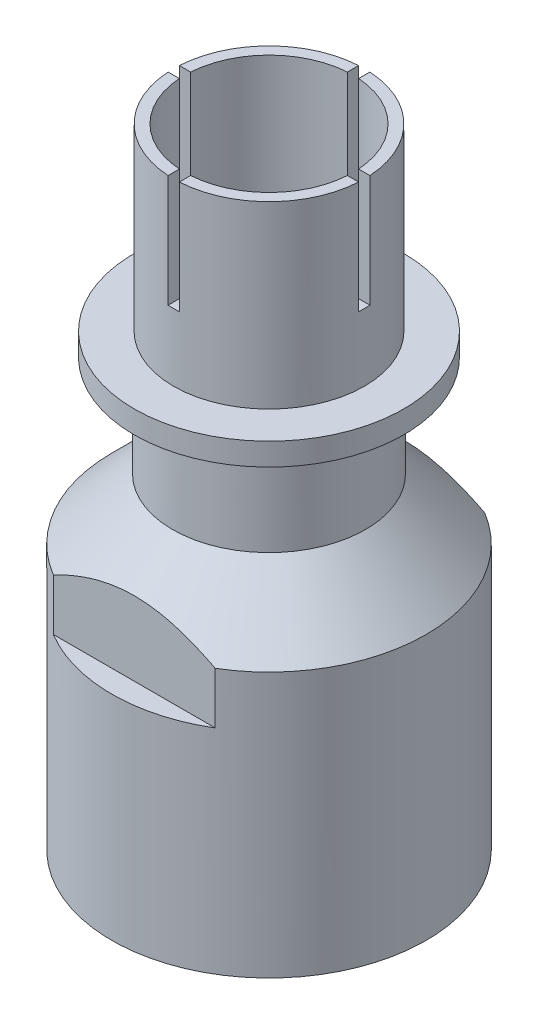
ISO-10303-21;
HEADER;
FILE_DESCRIPTION(('STEP AP214'),'2;1');
FILE_NAME('part.step','',(''),(''),'','','');
FILE_SCHEMA(('AUTOMOTIVE_DESIGN { 1 0 10303 214 1 1 1 1 }'));
ENDSEC;
DATA;
#1=APPLICATION_CONTEXT('core data for automotive mechanical design processes');
#2=APPLICATION_PROTOCOL_DEFINITION('international standard','automotive_design',2000,#1);
#3=PRODUCT_CONTEXT('',#1,'mechanical');
#4=PRODUCT('Part','Part','',(#3));
#5=PRODUCT_RELATED_PRODUCT_CATEGORY('part','',(#4));
#6=PRODUCT_DEFINITION_FORMATION('','',#4);
#7=PRODUCT_DEFINITION_CONTEXT('part definition',#1,'design');
#8=PRODUCT_DEFINITION('design','',#6,#7);
#9=PRODUCT_DEFINITION_SHAPE('','',#8);
#10=(LENGTH_UNIT() NAMED_UNIT(*) SI_UNIT(.MILLI.,.METRE.));
#11=(NAMED_UNIT(*) PLANE_ANGLE_UNIT() SI_UNIT($,.RADIAN.));
#12=(NAMED_UNIT(*) SI_UNIT($,.STERADIAN.) SOLID_ANGLE_UNIT());
#13=UNCERTAINTY_MEASURE_WITH_UNIT(LENGTH_MEASURE(1.E-05),#10,'distance_accuracy_value','');
#14=(GEOMETRIC_REPRESENTATION_CONTEXT(3) GLOBAL_UNCERTAINTY_ASSIGNED_CONTEXT((#13)) GLOBAL_UNIT_ASSIGNED_CONTEXT((#10,
#11,#12)) REPRESENTATION_CONTEXT('',''));
#15=CARTESIAN_POINT('',(0.,0.,0.));
#16=DIRECTION('',(0.,0.,1.));
#17=DIRECTION('',(1.,0.,0.));
#18=AXIS2_PLACEMENT_3D('',#15,#16,#17);
#19=CARTESIAN_POINT('',(0.249999999999969,23.,-6.49158589426691));
#20=DIRECTION('',(1.,0.,0.));
#21=DIRECTION('',(0.,0.,-1.));
#22=AXIS2_PLACEMENT_3D('',#19,#20,#21);
#23=PLANE('',#22);
#24=DIRECTION('',(0.,-1.,0.));
#25=VECTOR('',#24,1.);
#26=CARTESIAN_POINT('',(0.24999999999998,28.,-4.24264068711929));
#27=LINE('',#26,#25);
#28=CARTESIAN_POINT('',(0.249999999999981,23.,-4.24264068711929));
#29=VERTEX_POINT('',#28);
#30=CARTESIAN_POINT('',(0.24999999999998,28.,-4.24264068711929));
#31=VERTEX_POINT('',#30);
#32=EDGE_CURVE('E413',#29,#31,#27,.F.);
#33=ORIENTED_EDGE('',*,*,#32,.F.);
#34=DIRECTION('',(0.,0.,1.));
#35=VECTOR('',#34,1.);
#36=CARTESIAN_POINT('',(0.249999999999982,23.,-3.09948129979887));
#37=LINE('',#36,#35);
#38=CARTESIAN_POINT('',(0.249999999999983,23.,-3.74165738677394));
#39=VERTEX_POINT('',#38);
#40=EDGE_CURVE('E183',#39,#29,#37,.F.);
#41=ORIENTED_EDGE('',*,*,#40,.F.);
#42=DIRECTION('',(0.,1.,0.));
#43=VECTOR('',#42,1.);
#44=CARTESIAN_POINT('',(0.249999999999983,4.,-3.74165738677394));
#45=LINE('',#44,#43);
#46=CARTESIAN_POINT('',(0.249999999999981,28.,-3.74165738677394));
#47=VERTEX_POINT('',#46);
#48=EDGE_CURVE('E399',#39,#47,#45,.T.);
#49=ORIENTED_EDGE('',*,*,#48,.T.);
#50=DIRECTION('',(0.,0.,1.));
#51=VECTOR('',#50,1.);
#52=CARTESIAN_POINT('',(0.24999999999998,28.,0.));
#53=LINE('',#52,#51);
#54=EDGE_CURVE('E398',#31,#47,#53,.T.);
#55=ORIENTED_EDGE('',*,*,#54,.F.);
#56=EDGE_LOOP('',(#33,#41,#49,#55));
#57=FACE_BOUND('',#56,.T.);
#58=ADVANCED_FACE('F17',(#57),#23,.F.);
#59=CARTESIAN_POINT('',(0.,28.,0.));
#60=DIRECTION('',(0.,1.,0.));
#61=DIRECTION('',(0.,0.,1.));
#62=AXIS2_PLACEMENT_3D('',#59,#60,#61);
#63=PLANE('',#62);
#64=DIRECTION('',(-1.,0.,0.));
#65=VECTOR('',#64,1.);
#66=CARTESIAN_POINT('',(6.49158589426691,28.,-0.250000000000015));
#67=LINE('',#66,#65);
#68=CARTESIAN_POINT('',(3.74165738677394,28.,-0.250000000000009));
#69=VERTEX_POINT('',#68);
#70=CARTESIAN_POINT('',(4.24264068711929,28.,-0.25000000000001));
#71=VERTEX_POINT('',#70);
#72=EDGE_CURVE('E396',#69,#71,#67,.F.);
#73=ORIENTED_EDGE('',*,*,#72,.T.);
#74=CARTESIAN_POINT('',(0.,28.,0.));
#75=DIRECTION('',(0.,-1.,0.));
#76=DIRECTION('',(0.,0.,-1.));
#77=AXIS2_PLACEMENT_3D('',#74,#75,#76);
#78=CIRCLE('',#77,4.25);
#79=EDGE_CURVE('E412',#31,#71,#78,.T.);
#80=ORIENTED_EDGE('',*,*,#79,.F.);
#81=ORIENTED_EDGE('',*,*,#54,.T.);
#82=CARTESIAN_POINT('',(0.,28.,0.));
#83=DIRECTION('',(0.,1.,0.));
#84=DIRECTION('',(0.,0.,1.));
#85=AXIS2_PLACEMENT_3D('',#82,#83,#84);
#86=CIRCLE('',#85,3.75);
#87=EDGE_CURVE('E395',#47,#69,#86,.F.);
#88=ORIENTED_EDGE('',*,*,#87,.T.);
#89=EDGE_LOOP('',(#73,#80,#81,#88));
#90=FACE_BOUND('',#89,.T.);
#91=ADVANCED_FACE('F317',(#90),#63,.T.);
#92=CARTESIAN_POINT('',(6.49158589426691,23.,-0.250000000000015));
#93=DIRECTION('',(0.,0.,-1.));
#94=DIRECTION('',(-1.,0.,0.));
#95=AXIS2_PLACEMENT_3D('',#92,#93,#94);
#96=PLANE('',#95);
#97=DIRECTION('',(0.,-1.,0.));
#98=VECTOR('',#97,1.);
#99=CARTESIAN_POINT('',(4.24264068711929,28.,-0.25000000000001));
#100=LINE('',#99,#98);
#101=CARTESIAN_POINT('',(4.24264068711929,23.,-0.25000000000001));
#102=VERTEX_POINT('',#101);
#103=EDGE_CURVE('E409',#71,#102,#100,.T.);
#104=ORIENTED_EDGE('',*,*,#103,.F.);
#105=ORIENTED_EDGE('',*,*,#72,.F.);
#106=DIRECTION('',(0.,1.,0.));
#107=VECTOR('',#106,1.);
#108=CARTESIAN_POINT('',(3.74165738677394,4.,-0.250000000000009));
#109=LINE('',#108,#107);
#110=CARTESIAN_POINT('',(3.74165738677394,23.,-0.250000000000009));
#111=VERTEX_POINT('',#110);
#112=EDGE_CURVE('E393',#69,#111,#109,.F.);
#113=ORIENTED_EDGE('',*,*,#112,.T.);
#114=DIRECTION('',(1.,0.,0.));
#115=VECTOR('',#114,1.);
#116=CARTESIAN_POINT('',(3.09948129979887,23.,-0.25000000000001));
#117=LINE('',#116,#115);
#118=EDGE_CURVE('E392',#102,#111,#117,.F.);
#119=ORIENTED_EDGE('',*,*,#118,.F.);
#120=EDGE_LOOP('',(#104,#105,#113,#119));
#121=FACE_BOUND('',#120,.T.);
#122=ADVANCED_FACE('F313',(#121),#96,.F.);
#123=CARTESIAN_POINT('',(3.09948129979887,23.,-0.250000000000007));
#124=DIRECTION('',(0.,1.,0.));
#125=DIRECTION('',(0.,0.,1.));
#126=AXIS2_PLACEMENT_3D('',#123,#124,#125);
#127=PLANE('',#126);
#128=CARTESIAN_POINT('',(0.,23.,0.));
#129=DIRECTION('',(0.,-1.,0.));
#130=DIRECTION('',(0.,0.,-1.));
#131=AXIS2_PLACEMENT_3D('',#128,#129,#130);
#132=CIRCLE('',#131,4.25);
#133=CARTESIAN_POINT('',(4.24264068711929,23.,0.24999999999999));
#134=VERTEX_POINT('',#133);
#135=EDGE_CURVE('E406',#102,#134,#132,.T.);
#136=ORIENTED_EDGE('',*,*,#135,.F.);
#137=ORIENTED_EDGE('',*,*,#118,.T.);
#138=CARTESIAN_POINT('',(0.,23.,0.));
#139=DIRECTION('',(0.,1.,0.));
#140=DIRECTION('',(0.,0.,1.));
#141=AXIS2_PLACEMENT_3D('',#138,#139,#140);
#142=CIRCLE('',#141,3.75);
#143=CARTESIAN_POINT('',(3.74165738677394,23.,0.249999999999991));
#144=VERTEX_POINT('',#143);
#145=EDGE_CURVE('E389',#111,#144,#142,.F.);
#146=ORIENTED_EDGE('',*,*,#145,.T.);
#147=DIRECTION('',(1.,0.,0.));
#148=VECTOR('',#147,1.);
#149=CARTESIAN_POINT('',(6.49158589426691,23.,0.249999999999985));
#150=LINE('',#149,#148);
#151=EDGE_CURVE('E390',#144,#134,#150,.T.);
#152=ORIENTED_EDGE('',*,*,#151,.T.);
#153=EDGE_LOOP('',(#136,#137,#146,#152));
#154=FACE_BOUND('',#153,.T.);
#155=ADVANCED_FACE('F309',(#154),#127,.T.);
#156=CARTESIAN_POINT('',(6.49158589426691,23.,0.249999999999985));
#157=DIRECTION('',(0.,0.,1.));
#158=DIRECTION('',(1.,0.,0.));
#159=AXIS2_PLACEMENT_3D('',#156,#157,#158);
#160=PLANE('',#159);
#161=DIRECTION('',(0.,-1.,0.));
#162=VECTOR('',#161,1.);
#163=CARTESIAN_POINT('',(4.24264068711929,28.,0.24999999999999));
#164=LINE('',#163,#162);
#165=CARTESIAN_POINT('',(4.24264068711929,28.,0.24999999999999));
#166=VERTEX_POINT('',#165);
#167=EDGE_CURVE('E402',#134,#166,#164,.F.);
#168=ORIENTED_EDGE('',*,*,#167,.F.);
#169=ORIENTED_EDGE('',*,*,#151,.F.);
#170=DIRECTION('',(0.,1.,0.));
#171=VECTOR('',#170,1.);
#172=CARTESIAN_POINT('',(3.74165738677394,4.,0.249999999999991));
#173=LINE('',#172,#171);
#174=CARTESIAN_POINT('',(3.74165738677394,28.,0.249999999999991));
#175=VERTEX_POINT('',#174);
#176=EDGE_CURVE('E387',#144,#175,#173,.T.);
#177=ORIENTED_EDGE('',*,*,#176,.T.);
#178=DIRECTION('',(1.,0.,0.));
#179=VECTOR('',#178,1.);
#180=CARTESIAN_POINT('',(0.,28.,0.24999999999999));
#181=LINE('',#180,#179);
#182=EDGE_CURVE('E386',#166,#175,#181,.F.);
#183=ORIENTED_EDGE('',*,*,#182,.F.);
#184=EDGE_LOOP('',(#168,#169,#177,#183));
#185=FACE_BOUND('',#184,.T.);
#186=ADVANCED_FACE('F305',(#185),#160,.F.);
#187=CARTESIAN_POINT('',(0.,28.,0.));
#188=DIRECTION('',(0.,1.,0.));
#189=DIRECTION('',(0.,0.,1.));
#190=AXIS2_PLACEMENT_3D('',#187,#188,#189);
#191=PLANE('',#190);
#192=DIRECTION('',(0.,0.,-1.));
#193=VECTOR('',#192,1.);
#194=CARTESIAN_POINT('',(0.25,28.,6.49158589426691));
#195=LINE('',#194,#193);
#196=CARTESIAN_POINT('',(0.25,28.,3.74165738677394));
#197=VERTEX_POINT('',#196);
#198=CARTESIAN_POINT('',(0.25,28.,4.24264068711929));
#199=VERTEX_POINT('',#198);
#200=EDGE_CURVE('E384',#197,#199,#195,.F.);
#201=ORIENTED_EDGE('',*,*,#200,.T.);
#202=CARTESIAN_POINT('',(0.,28.,0.));
#203=DIRECTION('',(0.,-1.,0.));
#204=DIRECTION('',(0.,0.,-1.));
#205=AXIS2_PLACEMENT_3D('',#202,#203,#204);
#206=CIRCLE('',#205,4.25);
#207=EDGE_CURVE('E405',#166,#199,#206,.T.);
#208=ORIENTED_EDGE('',*,*,#207,.F.);
#209=ORIENTED_EDGE('',*,*,#182,.T.);
#210=CARTESIAN_POINT('',(0.,28.,0.));
#211=DIRECTION('',(0.,1.,0.));
#212=DIRECTION('',(0.,0.,1.));
#213=AXIS2_PLACEMENT_3D('',#210,#211,#212);
#214=CIRCLE('',#213,3.75);
#215=EDGE_CURVE('E383',#175,#197,#214,.F.);
#216=ORIENTED_EDGE('',*,*,#215,.T.);
#217=EDGE_LOOP('',(#201,#208,#209,#216));
#218=FACE_BOUND('',#217,.T.);
#219=ADVANCED_FACE('F301',(#218),#191,.T.);
#220=CARTESIAN_POINT('',(0.25,23.,6.49158589426691));
#221=DIRECTION('',(1.,0.,0.));
#222=DIRECTION('',(0.,0.,-1.));
#223=AXIS2_PLACEMENT_3D('',#220,#221,#222);
#224=PLANE('',#223);
#225=DIRECTION('',(0.,-1.,0.));
#226=VECTOR('',#225,1.);
#227=CARTESIAN_POINT('',(0.250000000000001,28.,4.24264068711929));
#228=LINE('',#227,#226);
#229=CARTESIAN_POINT('',(0.25,23.,4.24264068711929));
#230=VERTEX_POINT('',#229);
#231=EDGE_CURVE('E401',#199,#230,#228,.T.);
#232=ORIENTED_EDGE('',*,*,#231,.F.);
#233=ORIENTED_EDGE('',*,*,#200,.F.);
#234=DIRECTION('',(0.,1.,0.));
#235=VECTOR('',#234,1.);
#236=CARTESIAN_POINT('',(0.25,4.,3.74165738677394));
#237=LINE('',#236,#235);
#238=CARTESIAN_POINT('',(0.25,23.,3.74165738677394));
#239=VERTEX_POINT('',#238);
#240=EDGE_CURVE('E380',#197,#239,#237,.F.);
#241=ORIENTED_EDGE('',*,*,#240,.T.);
#242=DIRECTION('',(0.,0.,1.));
#243=VECTOR('',#242,1.);
#244=CARTESIAN_POINT('',(0.25,23.,3.09948129979887));
#245=LINE('',#244,#243);
#246=EDGE_CURVE('E379',#230,#239,#245,.F.);
#247=ORIENTED_EDGE('',*,*,#246,.F.);
#248=EDGE_LOOP('',(#232,#233,#241,#247));
#249=FACE_BOUND('',#248,.T.);
#250=ADVANCED_FACE('F297',(#249),#224,.F.);
#251=CARTESIAN_POINT('',(0.25,23.,3.09948129979887));
#252=DIRECTION('',(0.,1.,0.));
#253=DIRECTION('',(0.,0.,1.));
#254=AXIS2_PLACEMENT_3D('',#251,#252,#253);
#255=PLANE('',#254);
#256=CARTESIAN_POINT('',(0.,23.,0.));
#257=DIRECTION('',(0.,-1.,0.));
#258=DIRECTION('',(0.,0.,-1.));
#259=AXIS2_PLACEMENT_3D('',#256,#257,#258);
#260=CIRCLE('',#259,4.25);
#261=CARTESIAN_POINT('',(-0.25,23.,4.24264068711929));
#262=VERTEX_POINT('',#261);
#263=EDGE_CURVE('E419',#230,#262,#260,.T.);
#264=ORIENTED_EDGE('',*,*,#263,.F.);
#265=ORIENTED_EDGE('',*,*,#246,.T.);
#266=CARTESIAN_POINT('',(0.,23.,0.));
#267=DIRECTION('',(0.,1.,0.));
#268=DIRECTION('',(0.,0.,1.));
#269=AXIS2_PLACEMENT_3D('',#266,#267,#268);
#270=CIRCLE('',#269,3.75);
#271=CARTESIAN_POINT('',(-0.25,23.,3.74165738677394));
#272=VERTEX_POINT('',#271);
#273=EDGE_CURVE('E375',#239,#272,#270,.F.);
#274=ORIENTED_EDGE('',*,*,#273,.T.);
#275=DIRECTION('',(0.,0.,1.));
#276=VECTOR('',#275,1.);
#277=CARTESIAN_POINT('',(-0.25,23.,6.49158589426691));
#278=LINE('',#277,#276);
#279=EDGE_CURVE('E376',#272,#262,#278,.T.);
#280=ORIENTED_EDGE('',*,*,#279,.T.);
#281=EDGE_LOOP('',(#264,#265,#274,#280));
#282=FACE_BOUND('',#281,.T.);
#283=ADVANCED_FACE('F293',(#282),#255,.T.);
#284=CARTESIAN_POINT('',(-0.25,23.,6.49158589426691));
#285=DIRECTION('',(-1.,0.,0.));
#286=DIRECTION('',(0.,0.,1.));
#287=AXIS2_PLACEMENT_3D('',#284,#285,#286);
#288=PLANE('',#287);
#289=DIRECTION('',(0.,-1.,0.));
#290=VECTOR('',#289,1.);
#291=CARTESIAN_POINT('',(-0.25,28.,4.24264068711929));
#292=LINE('',#291,#290);
#293=CARTESIAN_POINT('',(-0.25,28.,4.24264068711929));
#294=VERTEX_POINT('',#293);
#295=EDGE_CURVE('E179',#262,#294,#292,.F.);
#296=ORIENTED_EDGE('',*,*,#295,.F.);
#297=ORIENTED_EDGE('',*,*,#279,.F.);
#298=DIRECTION('',(0.,1.,0.));
#299=VECTOR('',#298,1.);
#300=CARTESIAN_POINT('',(-0.25,4.,3.74165738677394));
#301=LINE('',#300,#299);
#302=CARTESIAN_POINT('',(-0.25,28.,3.74165738677394));
#303=VERTEX_POINT('',#302);
#304=EDGE_CURVE('E373',#272,#303,#301,.T.);
#305=ORIENTED_EDGE('',*,*,#304,.T.);
#306=DIRECTION('',(0.,0.,1.));
#307=VECTOR('',#306,1.);
#308=CARTESIAN_POINT('',(-0.25,28.,0.));
#309=LINE('',#308,#307);
#310=EDGE_CURVE('E164',#294,#303,#309,.F.);
#311=ORIENTED_EDGE('',*,*,#310,.F.);
#312=EDGE_LOOP('',(#296,#297,#305,#311));
#313=FACE_BOUND('',#312,.T.);
#314=ADVANCED_FACE('F290',(#313),#288,.F.);
#315=CARTESIAN_POINT('',(0.,28.,0.));
#316=DIRECTION('',(0.,1.,0.));
#317=DIRECTION('',(0.,0.,1.));
#318=AXIS2_PLACEMENT_3D('',#315,#316,#317);
#319=PLANE('',#318);
#320=ORIENTED_EDGE('',*,*,#310,.T.);
#321=CARTESIAN_POINT('',(0.,28.,0.));
#322=DIRECTION('',(0.,1.,0.));
#323=DIRECTION('',(0.,0.,1.));
#324=AXIS2_PLACEMENT_3D('',#321,#322,#323);
#325=CIRCLE('',#324,3.75);
#326=CARTESIAN_POINT('',(-3.74165738677394,28.,0.250000000000026));
#327=VERTEX_POINT('',#326);
#328=EDGE_CURVE('E160',#303,#327,#325,.F.);
#329=ORIENTED_EDGE('',*,*,#328,.T.);
#330=DIRECTION('',(1.,0.,0.));
#331=VECTOR('',#330,1.);
#332=CARTESIAN_POINT('',(-6.4915858942669,28.,0.250000000000045));
#333=LINE('',#332,#331);
#334=CARTESIAN_POINT('',(-4.24264068711928,28.,0.25000000000003));
#335=VERTEX_POINT('',#334);
#336=EDGE_CURVE('E153',#327,#335,#333,.F.);
#337=ORIENTED_EDGE('',*,*,#336,.T.);
#338=CARTESIAN_POINT('',(0.,28.,0.));
#339=DIRECTION('',(0.,-1.,0.));
#340=DIRECTION('',(0.,0.,-1.));
#341=AXIS2_PLACEMENT_3D('',#338,#339,#340);
#342=CIRCLE('',#341,4.25);
#343=EDGE_CURVE('E21',#294,#335,#342,.T.);
#344=ORIENTED_EDGE('',*,*,#343,.F.);
#345=EDGE_LOOP('',(#320,#329,#337,#344));
#346=FACE_BOUND('',#345,.T.);
#347=ADVANCED_FACE('F156',(#346),#319,.T.);
#348=CARTESIAN_POINT('',(-6.4915858942669,23.,0.250000000000045));
#349=DIRECTION('',(0.,0.,1.));
#350=DIRECTION('',(1.,0.,0.));
#351=AXIS2_PLACEMENT_3D('',#348,#349,#350);
#352=PLANE('',#351);
#353=DIRECTION('',(0.,-1.,0.));
#354=VECTOR('',#353,1.);
#355=CARTESIAN_POINT('',(-4.24264068711928,28.,0.250000000000031));
#356=LINE('',#355,#354);
#357=CARTESIAN_POINT('',(-4.24264068711928,23.,0.25000000000003));
#358=VERTEX_POINT('',#357);
#359=EDGE_CURVE('E167',#335,#358,#356,.T.);
#360=ORIENTED_EDGE('',*,*,#359,.F.);
#361=ORIENTED_EDGE('',*,*,#336,.F.);
#362=DIRECTION('',(0.,1.,0.));
#363=VECTOR('',#362,1.);
#364=CARTESIAN_POINT('',(-3.74165738677394,4.,0.250000000000025));
#365=LINE('',#364,#363);
#366=CARTESIAN_POINT('',(-3.74165738677394,23.,0.250000000000027));
#367=VERTEX_POINT('',#366);
#368=EDGE_CURVE('E371',#327,#367,#365,.F.);
#369=ORIENTED_EDGE('',*,*,#368,.T.);
#370=DIRECTION('',(1.,0.,0.));
#371=VECTOR('',#370,1.);
#372=CARTESIAN_POINT('',(-3.09948129979887,23.,0.250000000000029));
#373=LINE('',#372,#371);
#374=EDGE_CURVE('E163',#358,#367,#373,.T.);
#375=ORIENTED_EDGE('',*,*,#374,.F.);
#376=EDGE_LOOP('',(#360,#361,#369,#375));
#377=FACE_BOUND('',#376,.T.);
#378=ADVANCED_FACE('F168',(#377),#352,.F.);
#379=CARTESIAN_POINT('',(-3.09948129979887,23.,0.250000000000022));
#380=DIRECTION('',(0.,1.,0.));
#381=DIRECTION('',(0.,0.,1.));
#382=AXIS2_PLACEMENT_3D('',#379,#380,#381);
#383=PLANE('',#382);
#384=CARTESIAN_POINT('',(0.,23.,0.));
#385=DIRECTION('',(0.,-1.,0.));
#386=DIRECTION('',(0.,0.,-1.));
#387=AXIS2_PLACEMENT_3D('',#384,#385,#386);
#388=CIRCLE('',#387,4.25);
#389=CARTESIAN_POINT('',(-4.24264068711929,23.,-0.24999999999997));
#390=VERTEX_POINT('',#389);
#391=EDGE_CURVE('E173',#358,#390,#388,.T.);
#392=ORIENTED_EDGE('',*,*,#391,.F.);
#393=ORIENTED_EDGE('',*,*,#374,.T.);
#394=CARTESIAN_POINT('',(0.,23.,0.));
#395=DIRECTION('',(0.,1.,0.));
#396=DIRECTION('',(0.,0.,1.));
#397=AXIS2_PLACEMENT_3D('',#394,#395,#396);
#398=CIRCLE('',#397,3.75);
#399=CARTESIAN_POINT('',(-3.74165738677394,23.,-0.249999999999975));
#400=VERTEX_POINT('',#399);
#401=EDGE_CURVE('E368',#367,#400,#398,.F.);
#402=ORIENTED_EDGE('',*,*,#401,.T.);
#403=DIRECTION('',(-1.,0.,0.));
#404=VECTOR('',#403,1.);
#405=CARTESIAN_POINT('',(-6.49158589426691,23.,-0.249999999999955));
#406=LINE('',#405,#404);
#407=EDGE_CURVE('E369',#400,#390,#406,.T.);
#408=ORIENTED_EDGE('',*,*,#407,.T.);
#409=EDGE_LOOP('',(#392,#393,#402,#408));
#410=FACE_BOUND('',#409,.T.);
#411=ADVANCED_FACE('F281',(#410),#383,.T.);
#412=CARTESIAN_POINT('',(-6.49158589426691,23.,-0.249999999999955));
#413=DIRECTION('',(0.,0.,-1.));
#414=DIRECTION('',(-1.,0.,0.));
#415=AXIS2_PLACEMENT_3D('',#412,#413,#414);
#416=PLANE('',#415);
#417=DIRECTION('',(0.,-1.,0.));
#418=VECTOR('',#417,1.);
#419=CARTESIAN_POINT('',(-4.24264068711929,28.,-0.249999999999969));
#420=LINE('',#419,#418);
#421=CARTESIAN_POINT('',(-4.24264068711929,28.,-0.24999999999997));
#422=VERTEX_POINT('',#421);
#423=EDGE_CURVE('E421',#390,#422,#420,.F.);
#424=ORIENTED_EDGE('',*,*,#423,.F.);
#425=ORIENTED_EDGE('',*,*,#407,.F.);
#426=DIRECTION('',(0.,1.,0.));
#427=VECTOR('',#426,1.);
#428=CARTESIAN_POINT('',(-3.74165738677395,4.,-0.249999999999977));
#429=LINE('',#428,#427);
#430=CARTESIAN_POINT('',(-3.74165738677395,28.,-0.249999999999974));
#431=VERTEX_POINT('',#430);
#432=EDGE_CURVE('E366',#400,#431,#429,.T.);
#433=ORIENTED_EDGE('',*,*,#432,.T.);
#434=DIRECTION('',(1.,0.,0.));
#435=VECTOR('',#434,1.);
#436=CARTESIAN_POINT('',(0.,28.,-0.249999999999971));
#437=LINE('',#436,#435);
#438=EDGE_CURVE('E365',#422,#431,#437,.T.);
#439=ORIENTED_EDGE('',*,*,#438,.F.);
#440=EDGE_LOOP('',(#424,#425,#433,#439));
#441=FACE_BOUND('',#440,.T.);
#442=ADVANCED_FACE('F277',(#441),#416,.F.);
#443=CARTESIAN_POINT('',(0.,28.,0.));
#444=DIRECTION('',(0.,1.,0.));
#445=DIRECTION('',(0.,0.,1.));
#446=AXIS2_PLACEMENT_3D('',#443,#444,#445);
#447=PLANE('',#446);
#448=DIRECTION('',(0.,0.,1.));
#449=VECTOR('',#448,1.);
#450=CARTESIAN_POINT('',(-0.250000000000031,28.,-6.49158589426691));
#451=LINE('',#450,#449);
#452=CARTESIAN_POINT('',(-0.250000000000017,28.,-3.74165738677394));
#453=VERTEX_POINT('',#452);
#454=CARTESIAN_POINT('',(-0.25000000000002,28.,-4.24264068711928));
#455=VERTEX_POINT('',#454);
#456=EDGE_CURVE('E363',#453,#455,#451,.F.);
#457=ORIENTED_EDGE('',*,*,#456,.T.);
#458=CARTESIAN_POINT('',(0.,28.,0.));
#459=DIRECTION('',(0.,-1.,0.));
#460=DIRECTION('',(0.,0.,-1.));
#461=AXIS2_PLACEMENT_3D('',#458,#459,#460);
#462=CIRCLE('',#461,4.25);
#463=EDGE_CURVE('E420',#422,#455,#462,.T.);
#464=ORIENTED_EDGE('',*,*,#463,.F.);
#465=ORIENTED_EDGE('',*,*,#438,.T.);
#466=CARTESIAN_POINT('',(0.,28.,0.));
#467=DIRECTION('',(0.,1.,0.));
#468=DIRECTION('',(0.,0.,1.));
#469=AXIS2_PLACEMENT_3D('',#466,#467,#468);
#470=CIRCLE('',#469,3.75);
#471=EDGE_CURVE('E362',#431,#453,#470,.F.);
#472=ORIENTED_EDGE('',*,*,#471,.T.);
#473=EDGE_LOOP('',(#457,#464,#465,#472));
#474=FACE_BOUND('',#473,.T.);
#475=ADVANCED_FACE('F273',(#474),#447,.T.);
#476=CARTESIAN_POINT('',(-0.250000000000031,23.,-6.49158589426691));
#477=DIRECTION('',(-1.,0.,0.));
#478=DIRECTION('',(0.,0.,1.));
#479=AXIS2_PLACEMENT_3D('',#476,#477,#478);
#480=PLANE('',#479);
#481=DIRECTION('',(0.,-1.,0.));
#482=VECTOR('',#481,1.);
#483=CARTESIAN_POINT('',(-0.25000000000002,28.,-4.24264068711928));
#484=LINE('',#483,#482);
#485=CARTESIAN_POINT('',(-0.25000000000002,23.,-4.24264068711928));
#486=VERTEX_POINT('',#485);
#487=EDGE_CURVE('E417',#455,#486,#484,.T.);
#488=ORIENTED_EDGE('',*,*,#487,.F.);
#489=ORIENTED_EDGE('',*,*,#456,.F.);
#490=DIRECTION('',(0.,1.,0.));
#491=VECTOR('',#490,1.);
#492=CARTESIAN_POINT('',(-0.250000000000017,4.,-3.74165738677394));
#493=LINE('',#492,#491);
#494=CARTESIAN_POINT('',(-0.250000000000019,23.,-3.74165738677394));
#495=VERTEX_POINT('',#494);
#496=EDGE_CURVE('E359',#453,#495,#493,.F.);
#497=ORIENTED_EDGE('',*,*,#496,.T.);
#498=DIRECTION('',(0.,0.,1.));
#499=VECTOR('',#498,1.);
#500=CARTESIAN_POINT('',(-0.25000000000002,23.,-3.09948129979887));
#501=LINE('',#500,#499);
#502=EDGE_CURVE('E180',#486,#495,#501,.T.);
#503=ORIENTED_EDGE('',*,*,#502,.F.);
#504=EDGE_LOOP('',(#488,#489,#497,#503));
#505=FACE_BOUND('',#504,.T.);
#506=ADVANCED_FACE('F269',(#505),#480,.F.);
#507=CARTESIAN_POINT('',(-0.250000000000015,23.,-3.09948129979887));
#508=DIRECTION('',(0.,1.,0.));
#509=DIRECTION('',(0.,0.,1.));
#510=AXIS2_PLACEMENT_3D('',#507,#508,#509);
#511=PLANE('',#510);
#512=CARTESIAN_POINT('',(0.,23.,0.));
#513=DIRECTION('',(0.,-1.,0.));
#514=DIRECTION('',(0.,0.,-1.));
#515=AXIS2_PLACEMENT_3D('',#512,#513,#514);
#516=CIRCLE('',#515,4.25);
#517=EDGE_CURVE('E416',#486,#29,#516,.T.);
#518=ORIENTED_EDGE('',*,*,#517,.F.);
#519=ORIENTED_EDGE('',*,*,#502,.T.);
#520=CARTESIAN_POINT('',(0.,23.,0.));
#521=DIRECTION('',(0.,1.,0.));
#522=DIRECTION('',(0.,0.,1.));
#523=AXIS2_PLACEMENT_3D('',#520,#521,#522);
#524=CIRCLE('',#523,3.75);
#525=EDGE_CURVE('E361',#495,#39,#524,.F.);
#526=ORIENTED_EDGE('',*,*,#525,.T.);
#527=ORIENTED_EDGE('',*,*,#40,.T.);
#528=EDGE_LOOP('',(#518,#519,#526,#527));
#529=FACE_BOUND('',#528,.T.);
#530=ADVANCED_FACE('F265',(#529),#511,.T.);
#531=CARTESIAN_POINT('',(0.,28.,0.));
#532=DIRECTION('',(0.,-1.,0.));
#533=DIRECTION('',(0.,0.,-1.));
#534=AXIS2_PLACEMENT_3D('',#531,#532,#533);
#535=CYLINDRICAL_SURFACE('',#534,4.25);
#536=CARTESIAN_POINT('',(0.,20.,0.));
#537=DIRECTION('',(0.,-1.,0.));
#538=DIRECTION('',(0.,0.,-1.));
#539=AXIS2_PLACEMENT_3D('',#536,#537,#538);
#540=CIRCLE('',#539,4.25);
#541=CARTESIAN_POINT('',(0.,20.,-4.25));
#542=VERTEX_POINT('',#541);
#543=EDGE_CURVE('E443',#542,#542,#540,.T.);
#544=ORIENTED_EDGE('',*,*,#543,.F.);
#545=EDGE_LOOP('',(#544));
#546=FACE_BOUND('',#545,.T.);
#547=ORIENTED_EDGE('',*,*,#207,.T.);
#548=ORIENTED_EDGE('',*,*,#231,.T.);
#549=ORIENTED_EDGE('',*,*,#263,.T.);
#550=ORIENTED_EDGE('',*,*,#295,.T.);
#551=ORIENTED_EDGE('',*,*,#343,.T.);
#552=ORIENTED_EDGE('',*,*,#359,.T.);
#553=ORIENTED_EDGE('',*,*,#391,.T.);
#554=ORIENTED_EDGE('',*,*,#423,.T.);
#555=ORIENTED_EDGE('',*,*,#463,.T.);
#556=ORIENTED_EDGE('',*,*,#487,.T.);
#557=ORIENTED_EDGE('',*,*,#517,.T.);
#558=ORIENTED_EDGE('',*,*,#32,.T.);
#559=ORIENTED_EDGE('',*,*,#79,.T.);
#560=ORIENTED_EDGE('',*,*,#103,.T.);
#561=ORIENTED_EDGE('',*,*,#135,.T.);
#562=ORIENTED_EDGE('',*,*,#167,.T.);
#563=EDGE_LOOP('',(#547,#548,#549,#550,#551,#552,#553,#554,#555,#556,#557,#558,#559,#560,#561,#562));
#564=FACE_BOUND('',#563,.T.);
#565=ADVANCED_FACE('F176',(#546,#564),#535,.T.);
#566=CARTESIAN_POINT('',(0.,4.,0.));
#567=DIRECTION('',(0.,1.,0.));
#568=DIRECTION('',(0.,0.,1.));
#569=AXIS2_PLACEMENT_3D('',#566,#567,#568);
#570=CYLINDRICAL_SURFACE('',#569,3.75);
#571=ORIENTED_EDGE('',*,*,#273,.F.);
#572=ORIENTED_EDGE('',*,*,#240,.F.);
#573=ORIENTED_EDGE('',*,*,#215,.F.);
#574=ORIENTED_EDGE('',*,*,#176,.F.);
#575=ORIENTED_EDGE('',*,*,#145,.F.);
#576=ORIENTED_EDGE('',*,*,#112,.F.);
#577=ORIENTED_EDGE('',*,*,#87,.F.);
#578=ORIENTED_EDGE('',*,*,#48,.F.);
#579=ORIENTED_EDGE('',*,*,#525,.F.);
#580=ORIENTED_EDGE('',*,*,#496,.F.);
#581=ORIENTED_EDGE('',*,*,#471,.F.);
#582=ORIENTED_EDGE('',*,*,#432,.F.);
#583=ORIENTED_EDGE('',*,*,#401,.F.);
#584=ORIENTED_EDGE('',*,*,#368,.F.);
#585=ORIENTED_EDGE('',*,*,#328,.F.);
#586=ORIENTED_EDGE('',*,*,#304,.F.);
#587=EDGE_LOOP('',(#571,#572,#573,#574,#575,#576,#577,#578,#579,#580,#581,#582,#583,#584,#585,#586));
#588=FACE_BOUND('',#587,.T.);
#589=CARTESIAN_POINT('',(0.,18.5,0.));
#590=DIRECTION('',(0.,1.,0.));
#591=DIRECTION('',(0.,0.,1.));
#592=AXIS2_PLACEMENT_3D('',#589,#590,#591);
#593=CIRCLE('',#592,3.75);
#594=CARTESIAN_POINT('',(0.,18.5,3.75));
#595=VERTEX_POINT('',#594);
#596=EDGE_CURVE('E446',#595,#595,#593,.T.);
#597=ORIENTED_EDGE('',*,*,#596,.F.);
#598=EDGE_LOOP('',(#597));
#599=FACE_BOUND('',#598,.T.);
#600=ADVANCED_FACE('F258',(#588,#599),#570,.F.);
#601=CARTESIAN_POINT('',(0.,20.,0.));
#602=DIRECTION('',(0.,1.,0.));
#603=DIRECTION('',(0.,0.,1.));
#604=AXIS2_PLACEMENT_3D('',#601,#602,#603);
#605=PLANE('',#604);
#606=ORIENTED_EDGE('',*,*,#543,.T.);
#607=EDGE_LOOP('',(#606));
#608=FACE_BOUND('',#607,.T.);
#609=CARTESIAN_POINT('',(0.,20.,0.));
#610=DIRECTION('',(0.,-1.,0.));
#611=DIRECTION('',(0.,0.,-1.));
#612=AXIS2_PLACEMENT_3D('',#609,#610,#611);
#613=CIRCLE('',#612,6.);
#614=CARTESIAN_POINT('',(0.,20.,-6.));
#615=VERTEX_POINT('',#614);
#616=EDGE_CURVE('E449',#615,#615,#613,.T.);
#617=ORIENTED_EDGE('',*,*,#616,.F.);
#618=EDGE_LOOP('',(#617));
#619=FACE_BOUND('',#618,.T.);
#620=ADVANCED_FACE('F254',(#608,#619),#605,.T.);
#621=CARTESIAN_POINT('',(0.,18.5,0.));
#622=DIRECTION('',(0.,-1.,0.));
#623=DIRECTION('',(0.,0.,-1.));
#624=AXIS2_PLACEMENT_3D('',#621,#622,#623);
#625=PLANE('',#624);
#626=ORIENTED_EDGE('',*,*,#596,.T.);
#627=EDGE_LOOP('',(#626));
#628=FACE_BOUND('',#627,.T.);
#629=CARTESIAN_POINT('',(0.,18.5,0.));
#630=DIRECTION('',(0.,-1.,0.));
#631=DIRECTION('',(0.,0.,-1.));
#632=AXIS2_PLACEMENT_3D('',#629,#630,#631);
#633=CIRCLE('',#632,4.);
#634=CARTESIAN_POINT('',(0.,18.5,-4.));
#635=VERTEX_POINT('',#634);
#636=EDGE_CURVE('E452',#635,#635,#633,.T.);
#637=ORIENTED_EDGE('',*,*,#636,.T.);
#638=EDGE_LOOP('',(#637));
#639=FACE_BOUND('',#638,.T.);
#640=ADVANCED_FACE('F250',(#628,#639),#625,.T.);
#641=CARTESIAN_POINT('',(0.,20.,0.));
#642=DIRECTION('',(0.,-1.,0.));
#643=DIRECTION('',(0.,0.,-1.));
#644=AXIS2_PLACEMENT_3D('',#641,#642,#643);
#645=CYLINDRICAL_SURFACE('',#644,6.);
#646=ORIENTED_EDGE('',*,*,#616,.T.);
#647=EDGE_LOOP('',(#646));
#648=FACE_BOUND('',#647,.T.);
#649=CARTESIAN_POINT('',(0.,19.,0.));
#650=DIRECTION('',(0.,-1.,0.));
#651=DIRECTION('',(0.,0.,-1.));
#652=AXIS2_PLACEMENT_3D('',#649,#650,#651);
#653=CIRCLE('',#652,6.);
#654=CARTESIAN_POINT('',(0.,19.,-6.));
#655=VERTEX_POINT('',#654);
#656=EDGE_CURVE('E455',#655,#655,#653,.T.);
#657=ORIENTED_EDGE('',*,*,#656,.F.);
#658=EDGE_LOOP('',(#657));
#659=FACE_BOUND('',#658,.T.);
#660=ADVANCED_FACE('F246',(#648,#659),#645,.T.);
#661=CARTESIAN_POINT('',(0.,18.5,0.));
#662=DIRECTION('',(0.,-1.,0.));
#663=DIRECTION('',(0.,0.,-1.));
#664=AXIS2_PLACEMENT_3D('',#661,#662,#663);
#665=CYLINDRICAL_SURFACE('',#664,4.);
#666=CARTESIAN_POINT('',(0.,11.5,0.));
#667=DIRECTION('',(0.,-1.,0.));
#668=DIRECTION('',(0.,0.,-1.));
#669=AXIS2_PLACEMENT_3D('',#666,#667,#668);
#670=CIRCLE('',#669,4.);
#671=CARTESIAN_POINT('',(0.,11.5,-4.));
#672=VERTEX_POINT('',#671);
#673=EDGE_CURVE('E458',#672,#672,#670,.F.);
#674=ORIENTED_EDGE('',*,*,#673,.F.);
#675=EDGE_LOOP('',(#674));
#676=FACE_BOUND('',#675,.T.);
#677=ORIENTED_EDGE('',*,*,#636,.F.);
#678=EDGE_LOOP('',(#677));
#679=FACE_BOUND('',#678,.T.);
#680=ADVANCED_FACE('F242',(#676,#679),#665,.F.);
#681=CARTESIAN_POINT('',(0.,19.,0.));
#682=DIRECTION('',(0.,-1.,0.));
#683=DIRECTION('',(0.,0.,-1.));
#684=AXIS2_PLACEMENT_3D('',#681,#682,#683);
#685=PLANE('',#684);
#686=ORIENTED_EDGE('',*,*,#656,.T.);
#687=EDGE_LOOP('',(#686));
#688=FACE_BOUND('',#687,.T.);
#689=CARTESIAN_POINT('',(0.,19.,0.));
#690=DIRECTION('',(0.,-1.,0.));
#691=DIRECTION('',(0.,0.,-1.));
#692=AXIS2_PLACEMENT_3D('',#689,#690,#691);
#693=CIRCLE('',#692,4.29999999999999);
#694=CARTESIAN_POINT('',(0.,19.,-4.3));
#695=VERTEX_POINT('',#694);
#696=EDGE_CURVE('E461',#695,#695,#693,.T.);
#697=ORIENTED_EDGE('',*,*,#696,.F.);
#698=EDGE_LOOP('',(#697));
#699=FACE_BOUND('',#698,.T.);
#700=ADVANCED_FACE('F238',(#688,#699),#685,.T.);
#701=CARTESIAN_POINT('',(0.,11.5,0.));
#702=DIRECTION('',(0.,-1.,0.));
#703=DIRECTION('',(0.,0.,-1.));
#704=AXIS2_PLACEMENT_3D('',#701,#702,#703);
#705=PLANE('',#704);
#706=CARTESIAN_POINT('',(0.,11.5,0.));
#707=DIRECTION('',(0.,-1.,0.));
#708=DIRECTION('',(0.,0.,-1.));
#709=AXIS2_PLACEMENT_3D('',#706,#707,#708);
#710=CIRCLE('',#709,5.4);
#711=CARTESIAN_POINT('',(0.,11.5,-5.4));
#712=VERTEX_POINT('',#711);
#713=EDGE_CURVE('E463',#712,#712,#710,.T.);
#714=ORIENTED_EDGE('',*,*,#713,.T.);
#715=EDGE_LOOP('',(#714));
#716=FACE_BOUND('',#715,.T.);
#717=ORIENTED_EDGE('',*,*,#673,.T.);
#718=EDGE_LOOP('',(#717));
#719=FACE_BOUND('',#718,.T.);
#720=ADVANCED_FACE('F234',(#716,#719),#705,.T.);
#721=CARTESIAN_POINT('',(0.,19.,0.));
#722=DIRECTION('',(0.,-1.,0.));
#723=DIRECTION('',(0.,0.,-1.));
#724=AXIS2_PLACEMENT_3D('',#721,#722,#723);
#725=CYLINDRICAL_SURFACE('',#724,4.29999999999999);
#726=ORIENTED_EDGE('',*,*,#696,.T.);
#727=EDGE_LOOP('',(#726));
#728=FACE_BOUND('',#727,.T.);
#729=CARTESIAN_POINT('',(0.,14.5000000000449,0.));
#730=DIRECTION('',(0.,-1.,0.));
#731=DIRECTION('',(0.,0.,-1.));
#732=AXIS2_PLACEMENT_3D('',#729,#730,#731);
#733=CIRCLE('',#732,4.30000000000064);
#734=CARTESIAN_POINT('',(0.,14.5000000000449,-4.30000000000064));
#735=VERTEX_POINT('',#734);
#736=EDGE_CURVE('E355',#735,#735,#733,.T.);
#737=ORIENTED_EDGE('',*,*,#736,.F.);
#738=EDGE_LOOP('',(#737));
#739=FACE_BOUND('',#738,.T.);
#740=ADVANCED_FACE('F230',(#728,#739),#725,.T.);
#741=CARTESIAN_POINT('',(0.,0.,0.));
#742=DIRECTION('',(0.,-1.,0.));
#743=DIRECTION('',(0.,0.,-1.));
#744=AXIS2_PLACEMENT_3D('',#741,#742,#743);
#745=CYLINDRICAL_SURFACE('',#744,5.4);
#746=ORIENTED_EDGE('',*,*,#713,.F.);
#747=EDGE_LOOP('',(#746));
#748=FACE_BOUND('',#747,.T.);
#749=CARTESIAN_POINT('',(0.,0.,0.));
#750=DIRECTION('',(0.,-1.,0.));
#751=DIRECTION('',(0.,0.,-1.));
#752=AXIS2_PLACEMENT_3D('',#749,#750,#751);
#753=CIRCLE('',#752,5.4);
#754=CARTESIAN_POINT('',(0.,0.,-5.4));
#755=VERTEX_POINT('',#754);
#756=EDGE_CURVE('E193',#755,#755,#753,.T.);
#757=ORIENTED_EDGE('',*,*,#756,.T.);
#758=EDGE_LOOP('',(#757));
#759=FACE_BOUND('',#758,.T.);
#760=ADVANCED_FACE('F226',(#748,#759),#745,.F.);
#761=CARTESIAN_POINT('',(4.99999999999993,9.50000000000001,10.));
#762=DIRECTION('',(0.,-1.,0.));
#763=DIRECTION('',(0.,0.,-1.));
#764=AXIS2_PLACEMENT_3D('',#761,#762,#763);
#765=PLANE('',#764);
#766=CARTESIAN_POINT('',(0.,9.50000000000001,0.));
#767=DIRECTION('',(0.,-1.,0.));
#768=DIRECTION('',(0.,0.,-1.));
#769=AXIS2_PLACEMENT_3D('',#766,#767,#768);
#770=CIRCLE('',#769,7.);
#771=CARTESIAN_POINT('',(3.60555127546395,9.50000000000001,6.00000000000003));
#772=VERTEX_POINT('',#771);
#773=CARTESIAN_POINT('',(-3.60555127546403,9.50000000000001,5.99999999999998));
#774=VERTEX_POINT('',#773);
#775=EDGE_CURVE('E189',#772,#774,#770,.T.);
#776=ORIENTED_EDGE('',*,*,#775,.F.);
#777=DIRECTION('',(-1.,0.,0.));
#778=VECTOR('',#777,1.);
#779=CARTESIAN_POINT('',(4.99999999999996,9.50000000000001,6.00000000000004));
#780=LINE('',#779,#778);
#781=EDGE_CURVE('E358',#772,#774,#780,.T.);
#782=ORIENTED_EDGE('',*,*,#781,.T.);
#783=EDGE_LOOP('',(#776,#782));
#784=FACE_BOUND('',#783,.T.);
#785=ADVANCED_FACE('F222',(#784),#765,.F.);
#786=CARTESIAN_POINT('',(4.99999999999996,9.50000000000001,6.00000000000004));
#787=DIRECTION('',(0.,0.,-1.));
#788=DIRECTION('',(-1.,0.,0.));
#789=AXIS2_PLACEMENT_3D('',#786,#787,#788);
#790=PLANE('',#789);
#791=CARTESIAN_POINT('',(-3.60555127547952,11.8000000000118,5.99999999999952));
#792=CARTESIAN_POINT('',(-3.48295522942786,11.863136634487,5.99999999999981));
#793=CARTESIAN_POINT('',(-3.35940234633587,11.9244210440144,5.99999999999993));
#794=CARTESIAN_POINT('',(-3.11017574787468,12.0426980909625,6.00000000000003));
#795=CARTESIAN_POINT('',(-2.98450085051694,12.0996882329446,6.));
#796=CARTESIAN_POINT('',(-2.60249887757604,12.2639583521863,5.99999999999995));
#797=CARTESIAN_POINT('',(-2.34283270563123,12.3636752468555,5.99999999999998));
#798=CARTESIAN_POINT('',(-1.81527084365488,12.5363317211066,6.));
#799=CARTESIAN_POINT('',(-1.54740053129701,12.6093463048311,5.99999999999999));
#800=CARTESIAN_POINT('',(-1.14088569261698,12.6939334996277,5.99999999999999));
#801=CARTESIAN_POINT('',(-1.00478518864982,12.717957553202,5.99999999999999));
#802=CARTESIAN_POINT('',(-0.731327956275715,12.7571057944936,6.));
#803=CARTESIAN_POINT('',(-0.593971701158297,12.7722332054109,6.));
#804=CARTESIAN_POINT('',(-0.38034631646924,12.7884345240679,6.));
#805=CARTESIAN_POINT('',(-0.30431204964389,12.7927685379553,6.));
#806=CARTESIAN_POINT('',(-0.152188616229331,12.7985515653934,6.));
#807=CARTESIAN_POINT('',(-0.0760995240509318,12.8000025734706,6.));
#808=CARTESIAN_POINT('',(0.182048880383205,12.7999938437515,6.));
#809=CARTESIAN_POINT('',(0.364157460777951,12.791669062725,6.));
#810=CARTESIAN_POINT('',(0.726979002938163,12.7588256072417,6.00000000000001));
#811=CARTESIAN_POINT('',(0.90769091885313,12.7342958005874,6.00000000000001));
#812=CARTESIAN_POINT('',(1.26734144134199,12.6701818734642,6.00000000000001));
#813=CARTESIAN_POINT('',(1.44626632589776,12.6305217048213,6.00000000000001));
#814=CARTESIAN_POINT('',(1.80066090166035,12.5379644531418,6.00000000000002));
#815=CARTESIAN_POINT('',(1.97612980549759,12.4850643904686,6.00000000000002));
#816=CARTESIAN_POINT('',(2.27559649507135,12.3840607570666,6.00000000000002));
#817=CARTESIAN_POINT('',(2.40050868018298,12.3386226881238,6.00000000000002));
#818=CARTESIAN_POINT('',(2.64829958121888,12.2425269456478,6.00000000000002));
#819=CARTESIAN_POINT('',(2.77117838706038,12.1918695036381,6.00000000000002));
#820=CARTESIAN_POINT('',(3.01371831828051,12.0865304078856,6.00000000000002));
#821=CARTESIAN_POINT('',(3.13339937800352,12.0318943661635,6.00000000000002));
#822=CARTESIAN_POINT('',(3.37086485010443,11.9187300759246,6.00000000000002));
#823=CARTESIAN_POINT('',(3.48864983799046,11.8602030371933,6.00000000000003));
#824=CARTESIAN_POINT('',(3.60555127547209,11.8000000000158,6.00000000000003));
#825=B_SPLINE_CURVE_WITH_KNOTS('',3,(#791,#792,#793,#794,#795,#796,#797,#798,#799,#800,#801,
#802,#803,#804,#805,#806,#807,#808,#809,#810,#811,#812,#813,#814,#815,#816,#817,#818,#819,#820,
#821,#822,#823,#824),.UNSPECIFIED.,.F.,.F.,(4,2,2,2,2,2,2,2,2,2,2,2,2,2,2,2,4),(0.,
0.413673604436183,0.827585773633711,1.66095076419949,2.49195660178254,2.9063276517047,
3.32054848486918,3.54897181415174,3.77723706008368,4.32330397667175,4.86974640978486,
5.41897234754845,5.96832199986014,6.36696343528252,6.76558719517948,7.16020066289995,
7.55469200640141),.UNSPECIFIED.);
#826=CARTESIAN_POINT('',(-3.60555127547183,11.800000000006,5.99999999999998));
#827=VERTEX_POINT('',#826);
#828=CARTESIAN_POINT('',(3.60555127546802,11.8000000000079,6.00000000000003));
#829=VERTEX_POINT('',#828);
#830=EDGE_CURVE('E204',#827,#829,#825,.T.);
#831=ORIENTED_EDGE('',*,*,#830,.F.);
#832=DIRECTION('',(0.,-1.,0.));
#833=VECTOR('',#832,1.);
#834=CARTESIAN_POINT('',(-3.60555127546403,14.5,5.99999999999998));
#835=LINE('',#834,#833);
#836=EDGE_CURVE('E192',#774,#827,#835,.F.);
#837=ORIENTED_EDGE('',*,*,#836,.F.);
#838=ORIENTED_EDGE('',*,*,#781,.F.);
#839=DIRECTION('',(0.,-1.,0.));
#840=VECTOR('',#839,1.);
#841=CARTESIAN_POINT('',(3.60555127546395,14.5,6.00000000000003));
#842=LINE('',#841,#840);
#843=EDGE_CURVE('E196',#829,#772,#842,.T.);
#844=ORIENTED_EDGE('',*,*,#843,.F.);
#845=EDGE_LOOP('',(#831,#837,#838,#844));
#846=FACE_BOUND('',#845,.T.);
#847=ADVANCED_FACE('F216',(#846),#790,.F.);
#848=CARTESIAN_POINT('',(0.,11.8000000000718,0.));
#849=DIRECTION('',(0.,-1.,0.));
#850=DIRECTION('',(1.,0.,0.));
#851=AXIS2_PLACEMENT_3D('',#848,#849,#850);
#852=CONICAL_SURFACE('',#851,6.99999999994816,0.785398163388361);
#853=ORIENTED_EDGE('',*,*,#736,.T.);
#854=EDGE_LOOP('',(#853));
#855=FACE_BOUND('',#854,.T.);
#856=CARTESIAN_POINT('',(0.,11.8,0.));
#857=DIRECTION('',(0.,-1.,0.));
#858=DIRECTION('',(0.,0.,-1.));
#859=AXIS2_PLACEMENT_3D('',#856,#857,#858);
#860=CIRCLE('',#859,7.);
#861=CARTESIAN_POINT('',(-3.60555127546806,11.8000000000079,-6.));
#862=VERTEX_POINT('',#861);
#863=EDGE_CURVE('E469',#827,#862,#860,.T.);
#864=ORIENTED_EDGE('',*,*,#863,.F.);
#865=ORIENTED_EDGE('',*,*,#830,.T.);
#866=CARTESIAN_POINT('',(0.,11.8,0.));
#867=DIRECTION('',(0.,-1.,0.));
#868=DIRECTION('',(0.,0.,-1.));
#869=AXIS2_PLACEMENT_3D('',#866,#867,#868);
#870=CIRCLE('',#869,7.);
#871=CARTESIAN_POINT('',(3.60555127546806,11.8000000000079,-6.));
#872=VERTEX_POINT('',#871);
#873=EDGE_CURVE('E347',#872,#829,#870,.T.);
#874=ORIENTED_EDGE('',*,*,#873,.F.);
#875=CARTESIAN_POINT('',(3.60555127547214,11.8000000000158,-6.));
#876=CARTESIAN_POINT('',(3.48295522942064,11.8631366344907,-6.));
#877=CARTESIAN_POINT('',(3.35940234632885,11.9244210440179,-6.));
#878=CARTESIAN_POINT('',(3.11017574786811,12.0426980909655,-6.));
#879=CARTESIAN_POINT('',(2.98450085051061,12.0996882329474,-6.));
#880=CARTESIAN_POINT('',(2.60249887757044,12.2639583521886,-6.));
#881=CARTESIAN_POINT('',(2.34283270562614,12.3636752468573,-6.));
#882=CARTESIAN_POINT('',(1.81527084365083,12.5363317211077,-6.));
#883=CARTESIAN_POINT('',(1.54740053129351,12.6093463048319,-6.));
#884=CARTESIAN_POINT('',(1.14088569261432,12.6939334996281,-6.));
#885=CARTESIAN_POINT('',(1.00478518864745,12.7179575532024,-6.));
#886=CARTESIAN_POINT('',(0.731327956273924,12.7571057944938,-6.));
#887=CARTESIAN_POINT('',(0.593971701156801,12.772233205411,-6.));
#888=CARTESIAN_POINT('',(0.380346316468238,12.788434524068,-6.));
#889=CARTESIAN_POINT('',(0.304312049643085,12.7927685379554,-6.));
#890=CARTESIAN_POINT('',(0.152188616228923,12.7985515653934,-6.));
#891=CARTESIAN_POINT('',(0.0760995240507225,12.8000025734706,-6.));
#892=CARTESIAN_POINT('',(-0.182048880383215,12.7999938437515,-6.));
#893=CARTESIAN_POINT('',(-0.364157460777961,12.791669062725,-6.));
#894=CARTESIAN_POINT('',(-0.726979002938171,12.7588256072417,-6.));
#895=CARTESIAN_POINT('',(-0.907690918853136,12.7342958005874,-6.));
#896=CARTESIAN_POINT('',(-1.26734144134199,12.6701818734642,-6.));
#897=CARTESIAN_POINT('',(-1.44626632589777,12.6305217048213,-6.));
#898=CARTESIAN_POINT('',(-1.80066090166035,12.5379644531418,-6.));
#899=CARTESIAN_POINT('',(-1.97612980549759,12.4850643904686,-6.));
#900=CARTESIAN_POINT('',(-2.27559649507135,12.3840607570666,-6.));
#901=CARTESIAN_POINT('',(-2.40050868018299,12.3386226881238,-6.));
#902=CARTESIAN_POINT('',(-2.64829958121889,12.2425269456478,-6.));
#903=CARTESIAN_POINT('',(-2.7711783870604,12.1918695036381,-6.));
#904=CARTESIAN_POINT('',(-3.01371831828054,12.0865304078856,-6.));
#905=CARTESIAN_POINT('',(-3.13339937800354,12.0318943661635,-6.));
#906=CARTESIAN_POINT('',(-3.37086485010446,11.9187300759246,-6.));
#907=CARTESIAN_POINT('',(-3.4886498379905,11.8602030371933,-6.));
#908=CARTESIAN_POINT('',(-3.60555127547213,11.8000000000158,-6.));
#909=B_SPLINE_CURVE_WITH_KNOTS('',3,(#875,#876,#877,#878,#879,#880,#881,#882,#883,#884,#885,
#886,#887,#888,#889,#890,#891,#892,#893,#894,#895,#896,#897,#898,#899,#900,#901,#902,#903,#904,
#905,#906,#907,#908),.UNSPECIFIED.,.F.,.F.,(4,2,2,2,2,2,2,2,2,2,2,2,2,2,2,2,4),(0.,
0.413673604435289,0.827585773631928,1.66095076419589,2.49195660177713,2.90632765169839,
3.32054848486197,3.54897181414394,3.77723706007529,4.32330397666335,4.86974640977645,
5.41897234754005,5.96832199985173,6.36696343527412,6.76558719517109,7.16020066289157,
7.55469200639304),.UNSPECIFIED.);
#910=EDGE_CURVE('E197',#872,#862,#909,.T.);
#911=ORIENTED_EDGE('',*,*,#910,.T.);
#912=EDGE_LOOP('',(#864,#865,#874,#911));
#913=FACE_BOUND('',#912,.T.);
#914=ADVANCED_FACE('F213',(#855,#913),#852,.T.);
#915=CARTESIAN_POINT('',(-5.,9.50000000000001,-6.));
#916=DIRECTION('',(0.,0.,1.));
#917=DIRECTION('',(1.,0.,0.));
#918=AXIS2_PLACEMENT_3D('',#915,#916,#917);
#919=PLANE('',#918);
#920=ORIENTED_EDGE('',*,*,#910,.F.);
#921=DIRECTION('',(0.,-1.,0.));
#922=VECTOR('',#921,1.);
#923=CARTESIAN_POINT('',(3.60555127546399,14.5,-6.));
#924=LINE('',#923,#922);
#925=CARTESIAN_POINT('',(3.60555127546399,9.50000000000001,-6.));
#926=VERTEX_POINT('',#925);
#927=EDGE_CURVE('E350',#926,#872,#924,.F.);
#928=ORIENTED_EDGE('',*,*,#927,.F.);
#929=DIRECTION('',(1.,0.,0.));
#930=VECTOR('',#929,1.);
#931=CARTESIAN_POINT('',(-5.,9.50000000000001,-6.));
#932=LINE('',#931,#930);
#933=CARTESIAN_POINT('',(-3.60555127546399,9.50000000000001,-6.));
#934=VERTEX_POINT('',#933);
#935=EDGE_CURVE('E36',#926,#934,#932,.F.);
#936=ORIENTED_EDGE('',*,*,#935,.T.);
#937=DIRECTION('',(0.,-1.,0.));
#938=VECTOR('',#937,1.);
#939=CARTESIAN_POINT('',(-3.605551275464,14.5,-6.));
#940=LINE('',#939,#938);
#941=EDGE_CURVE('E188',#862,#934,#940,.T.);
#942=ORIENTED_EDGE('',*,*,#941,.F.);
#943=EDGE_LOOP('',(#920,#928,#936,#942));
#944=FACE_BOUND('',#943,.T.);
#945=ADVANCED_FACE('F210',(#944),#919,.F.);
#946=CARTESIAN_POINT('',(-5.,9.50000000000001,-10.));
#947=DIRECTION('',(0.,-1.,0.));
#948=DIRECTION('',(0.,0.,-1.));
#949=AXIS2_PLACEMENT_3D('',#946,#947,#948);
#950=PLANE('',#949);
#951=ORIENTED_EDGE('',*,*,#935,.F.);
#952=CARTESIAN_POINT('',(0.,9.50000000000001,0.));
#953=DIRECTION('',(0.,-1.,0.));
#954=DIRECTION('',(0.,0.,-1.));
#955=AXIS2_PLACEMENT_3D('',#952,#953,#954);
#956=CIRCLE('',#955,7.);
#957=EDGE_CURVE('E27',#934,#926,#956,.T.);
#958=ORIENTED_EDGE('',*,*,#957,.F.);
#959=EDGE_LOOP('',(#951,#958));
#960=FACE_BOUND('',#959,.T.);
#961=ADVANCED_FACE('F334',(#960),#950,.F.);
#962=CARTESIAN_POINT('',(0.,0.,0.));
#963=DIRECTION('',(0.,1.,0.));
#964=DIRECTION('',(0.,0.,1.));
#965=AXIS2_PLACEMENT_3D('',#962,#963,#964);
#966=PLANE('',#965);
#967=CARTESIAN_POINT('',(0.,0.,0.));
#968=DIRECTION('',(0.,-1.,0.));
#969=DIRECTION('',(0.,0.,-1.));
#970=AXIS2_PLACEMENT_3D('',#967,#968,#969);
#971=CIRCLE('',#970,7.);
#972=CARTESIAN_POINT('',(0.,0.,-7.));
#973=VERTEX_POINT('',#972);
#974=EDGE_CURVE('E11',#973,#973,#971,.F.);
#975=ORIENTED_EDGE('',*,*,#974,.F.);
#976=EDGE_LOOP('',(#975));
#977=FACE_BOUND('',#976,.T.);
#978=ORIENTED_EDGE('',*,*,#756,.F.);
#979=EDGE_LOOP('',(#978));
#980=FACE_BOUND('',#979,.T.);
#981=ADVANCED_FACE('F329',(#977,#980),#966,.F.);
#982=CARTESIAN_POINT('',(0.,14.5,0.));
#983=DIRECTION('',(0.,-1.,0.));
#984=DIRECTION('',(0.,0.,-1.));
#985=AXIS2_PLACEMENT_3D('',#982,#983,#984);
#986=CYLINDRICAL_SURFACE('',#985,7.);
#987=ORIENTED_EDGE('',*,*,#843,.T.);
#988=ORIENTED_EDGE('',*,*,#775,.T.);
#989=ORIENTED_EDGE('',*,*,#836,.T.);
#990=ORIENTED_EDGE('',*,*,#863,.T.);
#991=ORIENTED_EDGE('',*,*,#941,.T.);
#992=ORIENTED_EDGE('',*,*,#957,.T.);
#993=ORIENTED_EDGE('',*,*,#927,.T.);
#994=ORIENTED_EDGE('',*,*,#873,.T.);
#995=EDGE_LOOP('',(#987,#988,#989,#990,#991,#992,#993,#994));
#996=FACE_BOUND('',#995,.T.);
#997=ORIENTED_EDGE('',*,*,#974,.T.);
#998=EDGE_LOOP('',(#997));
#999=FACE_BOUND('',#998,.T.);
#1000=ADVANCED_FACE('F19',(#996,#999),#986,.T.);
#1001=CLOSED_SHELL('',(#58,#91,#122,#155,#186,#219,#250,#283,#314,#347,#378,#411,#442,#475,#506,
#530,#565,#600,#620,#640,#660,#680,#700,#720,#740,#760,#785,#847,#914,#945,#961,#981,#1000));
#1002=MANIFOLD_SOLID_BREP('B1',#1001);
#1003=ADVANCED_BREP_SHAPE_REPRESENTATION('',(#18,#1002),#14);
#1004=SHAPE_DEFINITION_REPRESENTATION(#9,#1003);
ENDSEC;
END-ISO-10303-21;
